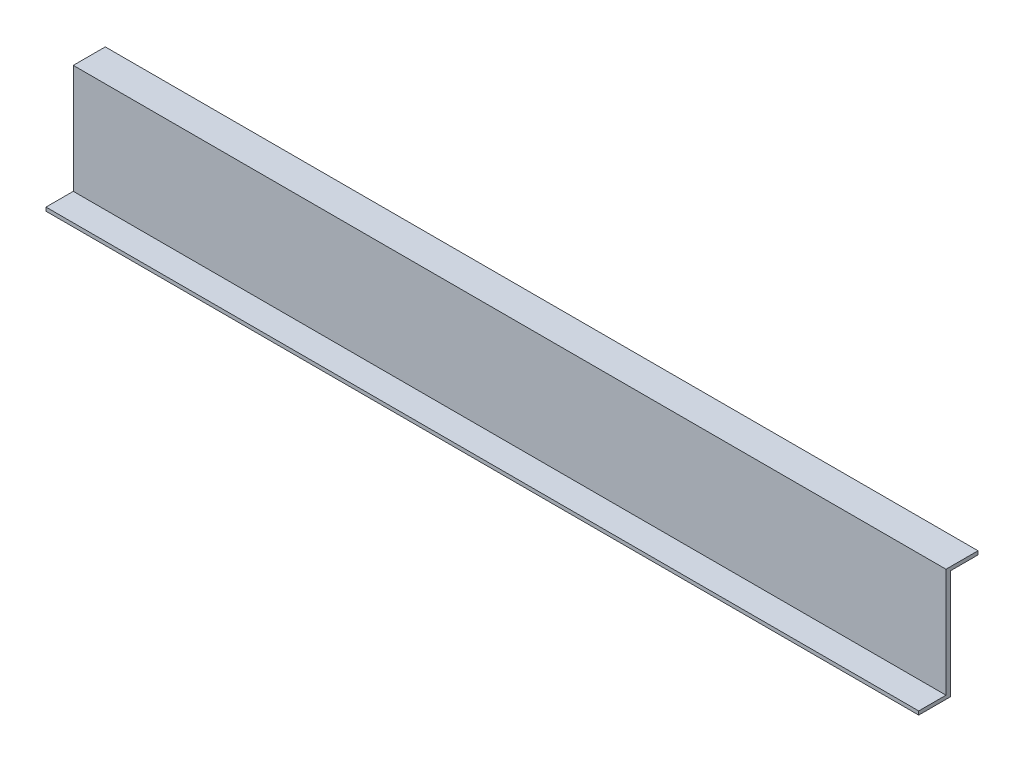
ISO-10303-21;
HEADER;
FILE_DESCRIPTION(('STEP AP214'),'2;1');
FILE_NAME('part.step','',(''),(''),'','','');
FILE_SCHEMA(('AUTOMOTIVE_DESIGN { 1 0 10303 214 1 1 1 1 }'));
ENDSEC;
DATA;
#1=APPLICATION_CONTEXT('core data for automotive mechanical design processes');
#2=APPLICATION_PROTOCOL_DEFINITION('international standard','automotive_design',2000,#1);
#3=PRODUCT_CONTEXT('',#1,'mechanical');
#4=PRODUCT('Part','Part','',(#3));
#5=PRODUCT_RELATED_PRODUCT_CATEGORY('part','',(#4));
#6=PRODUCT_DEFINITION_FORMATION('','',#4);
#7=PRODUCT_DEFINITION_CONTEXT('part definition',#1,'design');
#8=PRODUCT_DEFINITION('design','',#6,#7);
#9=PRODUCT_DEFINITION_SHAPE('','',#8);
#10=(LENGTH_UNIT() NAMED_UNIT(*) SI_UNIT(.MILLI.,.METRE.));
#11=(NAMED_UNIT(*) PLANE_ANGLE_UNIT() SI_UNIT($,.RADIAN.));
#12=(NAMED_UNIT(*) SI_UNIT($,.STERADIAN.) SOLID_ANGLE_UNIT());
#13=UNCERTAINTY_MEASURE_WITH_UNIT(LENGTH_MEASURE(1.E-05),#10,'distance_accuracy_value','');
#14=(GEOMETRIC_REPRESENTATION_CONTEXT(3) GLOBAL_UNCERTAINTY_ASSIGNED_CONTEXT((#13)) GLOBAL_UNIT_ASSIGNED_CONTEXT((#10,
#11,#12)) REPRESENTATION_CONTEXT('',''));
#15=CARTESIAN_POINT('',(0.,0.,0.));
#16=DIRECTION('',(0.,0.,1.));
#17=DIRECTION('',(1.,0.,0.));
#18=AXIS2_PLACEMENT_3D('',#15,#16,#17);
#19=CARTESIAN_POINT('',(0.,0.,44.704));
#20=DIRECTION('',(1.,0.,0.));
#21=DIRECTION('',(0.,0.,-1.));
#22=AXIS2_PLACEMENT_3D('',#19,#20,#21);
#23=PLANE('',#22);
#24=DIRECTION('',(0.,0.,-1.));
#25=VECTOR('',#24,1.);
#26=CARTESIAN_POINT('',(0.,2.54,0.));
#27=LINE('',#26,#25);
#28=CARTESIAN_POINT('',(0.,2.54,44.704));
#29=VERTEX_POINT('',#28);
#30=CARTESIAN_POINT('',(0.,2.54,25.654));
#31=VERTEX_POINT('',#30);
#32=EDGE_CURVE('E62',#29,#31,#27,.T.);
#33=ORIENTED_EDGE('',*,*,#32,.T.);
#34=DIRECTION('',(0.,1.,0.));
#35=VECTOR('',#34,1.);
#36=CARTESIAN_POINT('',(0.,0.,25.654));
#37=LINE('',#36,#35);
#38=CARTESIAN_POINT('',(0.,78.74,25.654));
#39=VERTEX_POINT('',#38);
#40=EDGE_CURVE('E114',#31,#39,#37,.T.);
#41=ORIENTED_EDGE('',*,*,#40,.T.);
#42=DIRECTION('',(0.,0.,-1.));
#43=VECTOR('',#42,1.);
#44=CARTESIAN_POINT('',(0.,78.74,44.704));
#45=LINE('',#44,#43);
#46=CARTESIAN_POINT('',(0.,78.74,3.30200000000001));
#47=VERTEX_POINT('',#46);
#48=EDGE_CURVE('E180',#39,#47,#45,.T.);
#49=ORIENTED_EDGE('',*,*,#48,.T.);
#50=DIRECTION('',(0.,-1.,0.));
#51=VECTOR('',#50,1.);
#52=CARTESIAN_POINT('',(0.,0.,3.30199999999998));
#53=LINE('',#52,#51);
#54=CARTESIAN_POINT('',(0.,76.2,3.30200000000001));
#55=VERTEX_POINT('',#54);
#56=EDGE_CURVE('E54',#47,#55,#53,.T.);
#57=ORIENTED_EDGE('',*,*,#56,.T.);
#58=DIRECTION('',(0.,0.,1.));
#59=VECTOR('',#58,1.);
#60=CARTESIAN_POINT('',(0.,76.2,0.));
#61=LINE('',#60,#59);
#62=CARTESIAN_POINT('',(0.,76.2,22.352));
#63=VERTEX_POINT('',#62);
#64=EDGE_CURVE('E138',#55,#63,#61,.T.);
#65=ORIENTED_EDGE('',*,*,#64,.T.);
#66=DIRECTION('',(0.,-1.,0.));
#67=VECTOR('',#66,1.);
#68=CARTESIAN_POINT('',(0.,0.,22.352));
#69=LINE('',#68,#67);
#70=CARTESIAN_POINT('',(0.,0.,22.352));
#71=VERTEX_POINT('',#70);
#72=EDGE_CURVE('E142',#63,#71,#69,.T.);
#73=ORIENTED_EDGE('',*,*,#72,.T.);
#74=DIRECTION('',(0.,0.,-1.));
#75=VECTOR('',#74,1.);
#76=CARTESIAN_POINT('',(0.,0.,44.704));
#77=LINE('',#76,#75);
#78=CARTESIAN_POINT('',(0.,0.,44.704));
#79=VERTEX_POINT('',#78);
#80=EDGE_CURVE('E11',#79,#71,#77,.T.);
#81=ORIENTED_EDGE('',*,*,#80,.F.);
#82=DIRECTION('',(0.,-1.,0.));
#83=VECTOR('',#82,1.);
#84=CARTESIAN_POINT('',(0.,0.,44.704));
#85=LINE('',#84,#83);
#86=EDGE_CURVE('E124',#29,#79,#85,.T.);
#87=ORIENTED_EDGE('',*,*,#86,.F.);
#88=EDGE_LOOP('',(#33,#41,#49,#57,#65,#73,#81,#87));
#89=FACE_BOUND('',#88,.T.);
#90=ADVANCED_FACE('F39',(#89),#23,.F.);
#91=CARTESIAN_POINT('',(0.,0.,44.704));
#92=DIRECTION('',(0.,1.,0.));
#93=DIRECTION('',(0.,0.,1.));
#94=AXIS2_PLACEMENT_3D('',#91,#92,#93);
#95=PLANE('',#94);
#96=ORIENTED_EDGE('',*,*,#80,.T.);
#97=DIRECTION('',(1.,0.,0.));
#98=VECTOR('',#97,1.);
#99=CARTESIAN_POINT('',(0.,0.,22.352));
#100=LINE('',#99,#98);
#101=CARTESIAN_POINT('',(609.6,0.,22.352));
#102=VERTEX_POINT('',#101);
#103=EDGE_CURVE('E165',#71,#102,#100,.T.);
#104=ORIENTED_EDGE('',*,*,#103,.T.);
#105=DIRECTION('',(0.,0.,-1.));
#106=VECTOR('',#105,1.);
#107=CARTESIAN_POINT('',(609.6,0.,44.704));
#108=LINE('',#107,#106);
#109=CARTESIAN_POINT('',(609.6,0.,44.704));
#110=VERTEX_POINT('',#109);
#111=EDGE_CURVE('E47',#110,#102,#108,.T.);
#112=ORIENTED_EDGE('',*,*,#111,.F.);
#113=DIRECTION('',(1.,0.,0.));
#114=VECTOR('',#113,1.);
#115=CARTESIAN_POINT('',(0.,0.,44.704));
#116=LINE('',#115,#114);
#117=EDGE_CURVE('E173',#79,#110,#116,.T.);
#118=ORIENTED_EDGE('',*,*,#117,.F.);
#119=EDGE_LOOP('',(#96,#104,#112,#118));
#120=FACE_BOUND('',#119,.T.);
#121=ADVANCED_FACE('F197',(#120),#95,.F.);
#122=CARTESIAN_POINT('',(609.6,0.,44.704));
#123=DIRECTION('',(-1.,0.,0.));
#124=DIRECTION('',(0.,0.,1.));
#125=AXIS2_PLACEMENT_3D('',#122,#123,#124);
#126=PLANE('',#125);
#127=DIRECTION('',(0.,0.,-1.));
#128=VECTOR('',#127,1.);
#129=CARTESIAN_POINT('',(609.6,78.74,44.704));
#130=LINE('',#129,#128);
#131=CARTESIAN_POINT('',(609.6,78.74,25.654));
#132=VERTEX_POINT('',#131);
#133=CARTESIAN_POINT('',(609.6,78.74,3.30200000000001));
#134=VERTEX_POINT('',#133);
#135=EDGE_CURVE('E183',#132,#134,#130,.T.);
#136=ORIENTED_EDGE('',*,*,#135,.F.);
#137=DIRECTION('',(0.,1.,0.));
#138=VECTOR('',#137,1.);
#139=CARTESIAN_POINT('',(609.6,0.,25.654));
#140=LINE('',#139,#138);
#141=CARTESIAN_POINT('',(609.6,2.54,25.654));
#142=VERTEX_POINT('',#141);
#143=EDGE_CURVE('E126',#142,#132,#140,.T.);
#144=ORIENTED_EDGE('',*,*,#143,.F.);
#145=DIRECTION('',(0.,0.,-1.));
#146=VECTOR('',#145,1.);
#147=CARTESIAN_POINT('',(609.6,2.54,0.));
#148=LINE('',#147,#146);
#149=CARTESIAN_POINT('',(609.6,2.54,44.704));
#150=VERTEX_POINT('',#149);
#151=EDGE_CURVE('E106',#150,#142,#148,.T.);
#152=ORIENTED_EDGE('',*,*,#151,.F.);
#153=DIRECTION('',(0.,1.,0.));
#154=VECTOR('',#153,1.);
#155=CARTESIAN_POINT('',(609.6,0.,44.704));
#156=LINE('',#155,#154);
#157=EDGE_CURVE('E176',#110,#150,#156,.T.);
#158=ORIENTED_EDGE('',*,*,#157,.F.);
#159=ORIENTED_EDGE('',*,*,#111,.T.);
#160=DIRECTION('',(0.,-1.,0.));
#161=VECTOR('',#160,1.);
#162=CARTESIAN_POINT('',(609.6,0.,22.352));
#163=LINE('',#162,#161);
#164=CARTESIAN_POINT('',(609.6,76.2,22.352));
#165=VERTEX_POINT('',#164);
#166=EDGE_CURVE('E154',#165,#102,#163,.T.);
#167=ORIENTED_EDGE('',*,*,#166,.F.);
#168=DIRECTION('',(0.,0.,1.));
#169=VECTOR('',#168,1.);
#170=CARTESIAN_POINT('',(609.6,76.2,0.));
#171=LINE('',#170,#169);
#172=CARTESIAN_POINT('',(609.6,76.2,3.30200000000001));
#173=VERTEX_POINT('',#172);
#174=EDGE_CURVE('E150',#173,#165,#171,.T.);
#175=ORIENTED_EDGE('',*,*,#174,.F.);
#176=DIRECTION('',(0.,-1.,0.));
#177=VECTOR('',#176,1.);
#178=CARTESIAN_POINT('',(609.6,0.,3.30199999999998));
#179=LINE('',#178,#177);
#180=EDGE_CURVE('E143',#134,#173,#179,.T.);
#181=ORIENTED_EDGE('',*,*,#180,.F.);
#182=EDGE_LOOP('',(#136,#144,#152,#158,#159,#167,#175,#181));
#183=FACE_BOUND('',#182,.T.);
#184=ADVANCED_FACE('F193',(#183),#126,.F.);
#185=CARTESIAN_POINT('',(0.,78.74,44.704));
#186=DIRECTION('',(0.,-1.,0.));
#187=DIRECTION('',(0.,0.,-1.));
#188=AXIS2_PLACEMENT_3D('',#185,#186,#187);
#189=PLANE('',#188);
#190=ORIENTED_EDGE('',*,*,#48,.F.);
#191=DIRECTION('',(1.,0.,0.));
#192=VECTOR('',#191,1.);
#193=CARTESIAN_POINT('',(0.,78.74,25.654));
#194=LINE('',#193,#192);
#195=EDGE_CURVE('E110',#39,#132,#194,.T.);
#196=ORIENTED_EDGE('',*,*,#195,.T.);
#197=ORIENTED_EDGE('',*,*,#135,.T.);
#198=DIRECTION('',(1.,0.,0.));
#199=VECTOR('',#198,1.);
#200=CARTESIAN_POINT('',(0.,78.74,3.30200000000001));
#201=LINE('',#200,#199);
#202=EDGE_CURVE('E162',#47,#134,#201,.T.);
#203=ORIENTED_EDGE('',*,*,#202,.F.);
#204=EDGE_LOOP('',(#190,#196,#197,#203));
#205=FACE_BOUND('',#204,.T.);
#206=ADVANCED_FACE('F206',(#205),#189,.F.);
#207=CARTESIAN_POINT('',(0.,0.,44.704));
#208=DIRECTION('',(0.,0.,-1.));
#209=DIRECTION('',(-1.,0.,0.));
#210=AXIS2_PLACEMENT_3D('',#207,#208,#209);
#211=PLANE('',#210);
#212=ORIENTED_EDGE('',*,*,#157,.T.);
#213=DIRECTION('',(1.,0.,0.));
#214=VECTOR('',#213,1.);
#215=CARTESIAN_POINT('',(0.,2.54,44.704));
#216=LINE('',#215,#214);
#217=EDGE_CURVE('E111',#29,#150,#216,.T.);
#218=ORIENTED_EDGE('',*,*,#217,.F.);
#219=ORIENTED_EDGE('',*,*,#86,.T.);
#220=ORIENTED_EDGE('',*,*,#117,.T.);
#221=EDGE_LOOP('',(#212,#218,#219,#220));
#222=FACE_BOUND('',#221,.T.);
#223=ADVANCED_FACE('F228',(#222),#211,.F.);
#224=CARTESIAN_POINT('',(0.,0.,25.654));
#225=DIRECTION('',(0.,0.,-1.));
#226=DIRECTION('',(-1.,0.,0.));
#227=AXIS2_PLACEMENT_3D('',#224,#225,#226);
#228=PLANE('',#227);
#229=ORIENTED_EDGE('',*,*,#143,.T.);
#230=ORIENTED_EDGE('',*,*,#195,.F.);
#231=ORIENTED_EDGE('',*,*,#40,.F.);
#232=DIRECTION('',(1.,0.,0.));
#233=VECTOR('',#232,1.);
#234=CARTESIAN_POINT('',(0.,2.54,25.654));
#235=LINE('',#234,#233);
#236=EDGE_CURVE('E102',#31,#142,#235,.T.);
#237=ORIENTED_EDGE('',*,*,#236,.T.);
#238=EDGE_LOOP('',(#229,#230,#231,#237));
#239=FACE_BOUND('',#238,.T.);
#240=ADVANCED_FACE('F115',(#239),#228,.F.);
#241=CARTESIAN_POINT('',(0.,2.54,0.));
#242=DIRECTION('',(0.,-1.,0.));
#243=DIRECTION('',(0.,0.,-1.));
#244=AXIS2_PLACEMENT_3D('',#241,#242,#243);
#245=PLANE('',#244);
#246=ORIENTED_EDGE('',*,*,#151,.T.);
#247=ORIENTED_EDGE('',*,*,#236,.F.);
#248=ORIENTED_EDGE('',*,*,#32,.F.);
#249=ORIENTED_EDGE('',*,*,#217,.T.);
#250=EDGE_LOOP('',(#246,#247,#248,#249));
#251=FACE_BOUND('',#250,.T.);
#252=ADVANCED_FACE('F104',(#251),#245,.F.);
#253=CARTESIAN_POINT('',(0.,76.2,0.));
#254=DIRECTION('',(0.,1.,0.));
#255=DIRECTION('',(0.,0.,1.));
#256=AXIS2_PLACEMENT_3D('',#253,#254,#255);
#257=PLANE('',#256);
#258=ORIENTED_EDGE('',*,*,#174,.T.);
#259=DIRECTION('',(1.,0.,0.));
#260=VECTOR('',#259,1.);
#261=CARTESIAN_POINT('',(0.,76.2,22.352));
#262=LINE('',#261,#260);
#263=EDGE_CURVE('E149',#63,#165,#262,.T.);
#264=ORIENTED_EDGE('',*,*,#263,.F.);
#265=ORIENTED_EDGE('',*,*,#64,.F.);
#266=DIRECTION('',(1.,0.,0.));
#267=VECTOR('',#266,1.);
#268=CARTESIAN_POINT('',(0.,76.2,3.30200000000001));
#269=LINE('',#268,#267);
#270=EDGE_CURVE('E132',#55,#173,#269,.T.);
#271=ORIENTED_EDGE('',*,*,#270,.T.);
#272=EDGE_LOOP('',(#258,#264,#265,#271));
#273=FACE_BOUND('',#272,.T.);
#274=ADVANCED_FACE('F203',(#273),#257,.F.);
#275=CARTESIAN_POINT('',(0.,0.,3.30199999999998));
#276=DIRECTION('',(0.,0.,1.));
#277=DIRECTION('',(0.,-1.,0.));
#278=AXIS2_PLACEMENT_3D('',#275,#276,#277);
#279=PLANE('',#278);
#280=ORIENTED_EDGE('',*,*,#180,.T.);
#281=ORIENTED_EDGE('',*,*,#270,.F.);
#282=ORIENTED_EDGE('',*,*,#56,.F.);
#283=ORIENTED_EDGE('',*,*,#202,.T.);
#284=EDGE_LOOP('',(#280,#281,#282,#283));
#285=FACE_BOUND('',#284,.T.);
#286=ADVANCED_FACE('F207',(#285),#279,.F.);
#287=CARTESIAN_POINT('',(0.,0.,22.352));
#288=DIRECTION('',(0.,0.,1.));
#289=DIRECTION('',(0.,-1.,0.));
#290=AXIS2_PLACEMENT_3D('',#287,#288,#289);
#291=PLANE('',#290);
#292=ORIENTED_EDGE('',*,*,#166,.T.);
#293=ORIENTED_EDGE('',*,*,#103,.F.);
#294=ORIENTED_EDGE('',*,*,#72,.F.);
#295=ORIENTED_EDGE('',*,*,#263,.T.);
#296=EDGE_LOOP('',(#292,#293,#294,#295));
#297=FACE_BOUND('',#296,.T.);
#298=ADVANCED_FACE('F200',(#297),#291,.F.);
#299=CLOSED_SHELL('',(#90,#121,#184,#206,#223,#240,#252,#274,#286,#298));
#300=MANIFOLD_SOLID_BREP('B2',#299);
#301=ADVANCED_BREP_SHAPE_REPRESENTATION('',(#18,#300),#14);
#302=SHAPE_DEFINITION_REPRESENTATION(#9,#301);
ENDSEC;
END-ISO-10303-21;
